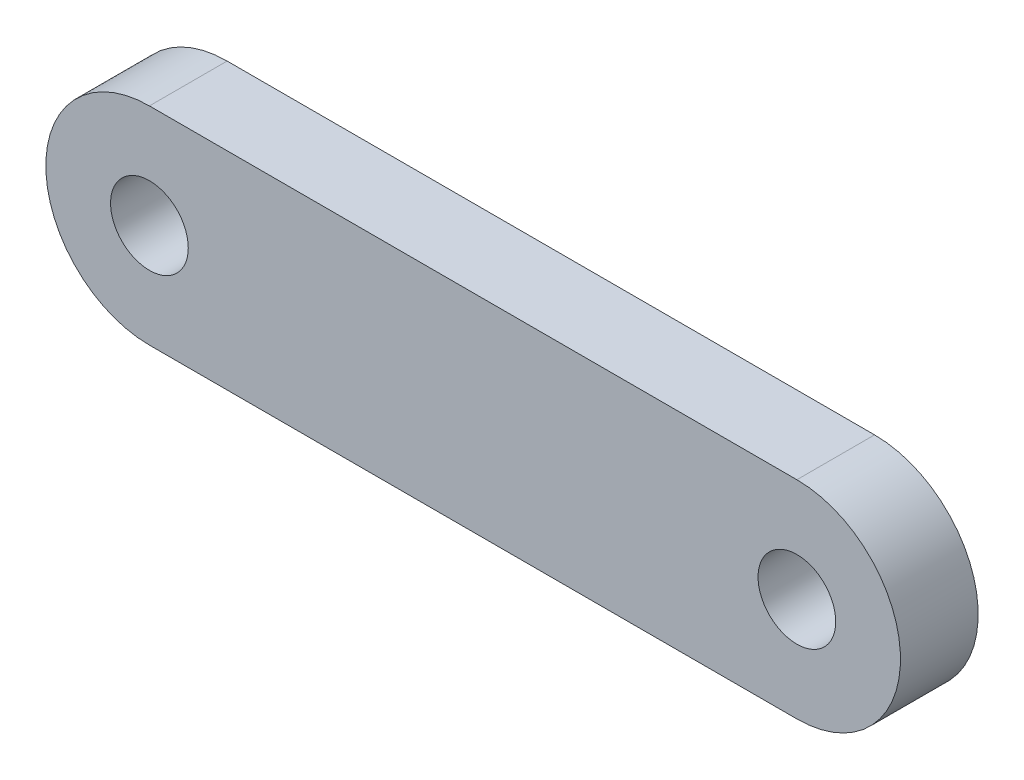
ISO-10303-21;
HEADER;
FILE_DESCRIPTION(('STEP AP214'),'2;1');
FILE_NAME('part.step','',(''),(''),'','','');
FILE_SCHEMA(('AUTOMOTIVE_DESIGN { 1 0 10303 214 1 1 1 1 }'));
ENDSEC;
DATA;
#1=APPLICATION_CONTEXT('core data for automotive mechanical design processes');
#2=APPLICATION_PROTOCOL_DEFINITION('international standard','automotive_design',2000,#1);
#3=PRODUCT_CONTEXT('',#1,'mechanical');
#4=PRODUCT('Part','Part','',(#3));
#5=PRODUCT_RELATED_PRODUCT_CATEGORY('part','',(#4));
#6=PRODUCT_DEFINITION_FORMATION('','',#4);
#7=PRODUCT_DEFINITION_CONTEXT('part definition',#1,'design');
#8=PRODUCT_DEFINITION('design','',#6,#7);
#9=PRODUCT_DEFINITION_SHAPE('','',#8);
#10=(LENGTH_UNIT() NAMED_UNIT(*) SI_UNIT(.MILLI.,.METRE.));
#11=(NAMED_UNIT(*) PLANE_ANGLE_UNIT() SI_UNIT($,.RADIAN.));
#12=(NAMED_UNIT(*) SI_UNIT($,.STERADIAN.) SOLID_ANGLE_UNIT());
#13=UNCERTAINTY_MEASURE_WITH_UNIT(LENGTH_MEASURE(1.E-05),#10,'distance_accuracy_value','');
#14=(GEOMETRIC_REPRESENTATION_CONTEXT(3) GLOBAL_UNCERTAINTY_ASSIGNED_CONTEXT((#13)) GLOBAL_UNIT_ASSIGNED_CONTEXT((#10,
#11,#12)) REPRESENTATION_CONTEXT('',''));
#15=CARTESIAN_POINT('',(0.,0.,0.));
#16=DIRECTION('',(0.,0.,1.));
#17=DIRECTION('',(1.,0.,0.));
#18=AXIS2_PLACEMENT_3D('',#15,#16,#17);
#19=CARTESIAN_POINT('',(-25.,0.,3.));
#20=DIRECTION('',(0.,0.,1.));
#21=DIRECTION('',(1.,0.,0.));
#22=AXIS2_PLACEMENT_3D('',#19,#20,#21);
#23=PLANE('',#22);
#24=CARTESIAN_POINT('',(0.,0.,3.));
#25=DIRECTION('',(0.,0.,1.));
#26=DIRECTION('',(1.,0.,0.));
#27=AXIS2_PLACEMENT_3D('',#24,#25,#26);
#28=CIRCLE('',#27,1.5);
#29=CARTESIAN_POINT('',(1.5,0.,3.));
#30=VERTEX_POINT('',#29);
#31=EDGE_CURVE('E116',#30,#30,#28,.T.);
#32=ORIENTED_EDGE('',*,*,#31,.F.);
#33=EDGE_LOOP('',(#32));
#34=FACE_BOUND('',#33,.T.);
#35=CARTESIAN_POINT('',(-25.,0.,3.));
#36=DIRECTION('',(0.,0.,1.));
#37=DIRECTION('',(1.,0.,0.));
#38=AXIS2_PLACEMENT_3D('',#35,#36,#37);
#39=CIRCLE('',#38,4.);
#40=CARTESIAN_POINT('',(-25.,4.,3.));
#41=VERTEX_POINT('',#40);
#42=CARTESIAN_POINT('',(-25.,-4.,3.));
#43=VERTEX_POINT('',#42);
#44=EDGE_CURVE('E96',#41,#43,#39,.T.);
#45=ORIENTED_EDGE('',*,*,#44,.T.);
#46=DIRECTION('',(1.,0.,0.));
#47=VECTOR('',#46,1.);
#48=CARTESIAN_POINT('',(-25.,-4.,3.));
#49=LINE('',#48,#47);
#50=CARTESIAN_POINT('',(0.,-4.,3.));
#51=VERTEX_POINT('',#50);
#52=EDGE_CURVE('E91',#43,#51,#49,.T.);
#53=ORIENTED_EDGE('',*,*,#52,.T.);
#54=CARTESIAN_POINT('',(0.,0.,3.));
#55=DIRECTION('',(0.,0.,1.));
#56=DIRECTION('',(1.,0.,0.));
#57=AXIS2_PLACEMENT_3D('',#54,#55,#56);
#58=CIRCLE('',#57,4.);
#59=CARTESIAN_POINT('',(0.,4.,3.));
#60=VERTEX_POINT('',#59);
#61=EDGE_CURVE('E94',#51,#60,#58,.T.);
#62=ORIENTED_EDGE('',*,*,#61,.T.);
#63=DIRECTION('',(-1.,0.,0.));
#64=VECTOR('',#63,1.);
#65=CARTESIAN_POINT('',(-25.,4.,3.));
#66=LINE('',#65,#64);
#67=EDGE_CURVE('E61',#60,#41,#66,.T.);
#68=ORIENTED_EDGE('',*,*,#67,.T.);
#69=EDGE_LOOP('',(#45,#53,#62,#68));
#70=FACE_BOUND('',#69,.T.);
#71=CARTESIAN_POINT('',(-25.,0.,3.));
#72=DIRECTION('',(0.,0.,1.));
#73=DIRECTION('',(1.,0.,0.));
#74=AXIS2_PLACEMENT_3D('',#71,#72,#73);
#75=CIRCLE('',#74,1.5);
#76=CARTESIAN_POINT('',(-23.5,0.,3.));
#77=VERTEX_POINT('',#76);
#78=EDGE_CURVE('E138',#77,#77,#75,.T.);
#79=ORIENTED_EDGE('',*,*,#78,.F.);
#80=EDGE_LOOP('',(#79));
#81=FACE_BOUND('',#80,.T.);
#82=ADVANCED_FACE('F43',(#34,#70,#81),#23,.T.);
#83=CARTESIAN_POINT('',(-25.,0.,0.));
#84=DIRECTION('',(0.,0.,1.));
#85=DIRECTION('',(1.,0.,0.));
#86=AXIS2_PLACEMENT_3D('',#83,#84,#85);
#87=PLANE('',#86);
#88=CARTESIAN_POINT('',(-25.,0.,0.));
#89=DIRECTION('',(0.,0.,1.));
#90=DIRECTION('',(1.,0.,0.));
#91=AXIS2_PLACEMENT_3D('',#88,#89,#90);
#92=CIRCLE('',#91,4.);
#93=CARTESIAN_POINT('',(-25.,4.,0.));
#94=VERTEX_POINT('',#93);
#95=CARTESIAN_POINT('',(-25.,-4.,0.));
#96=VERTEX_POINT('',#95);
#97=EDGE_CURVE('E112',#94,#96,#92,.T.);
#98=ORIENTED_EDGE('',*,*,#97,.F.);
#99=DIRECTION('',(-1.,0.,0.));
#100=VECTOR('',#99,1.);
#101=CARTESIAN_POINT('',(-25.,4.,0.));
#102=LINE('',#101,#100);
#103=CARTESIAN_POINT('',(0.,4.,0.));
#104=VERTEX_POINT('',#103);
#105=EDGE_CURVE('E84',#104,#94,#102,.T.);
#106=ORIENTED_EDGE('',*,*,#105,.F.);
#107=CARTESIAN_POINT('',(0.,0.,0.));
#108=DIRECTION('',(0.,0.,1.));
#109=DIRECTION('',(1.,0.,0.));
#110=AXIS2_PLACEMENT_3D('',#107,#108,#109);
#111=CIRCLE('',#110,4.);
#112=CARTESIAN_POINT('',(0.,-4.,0.));
#113=VERTEX_POINT('',#112);
#114=EDGE_CURVE('E78',#113,#104,#111,.T.);
#115=ORIENTED_EDGE('',*,*,#114,.F.);
#116=DIRECTION('',(1.,0.,0.));
#117=VECTOR('',#116,1.);
#118=CARTESIAN_POINT('',(-25.,-4.,0.));
#119=LINE('',#118,#117);
#120=EDGE_CURVE('E101',#96,#113,#119,.T.);
#121=ORIENTED_EDGE('',*,*,#120,.F.);
#122=EDGE_LOOP('',(#98,#106,#115,#121));
#123=FACE_BOUND('',#122,.T.);
#124=CARTESIAN_POINT('',(0.,0.,0.));
#125=DIRECTION('',(0.,0.,1.));
#126=DIRECTION('',(1.,0.,0.));
#127=AXIS2_PLACEMENT_3D('',#124,#125,#126);
#128=CIRCLE('',#127,1.5);
#129=CARTESIAN_POINT('',(1.5,0.,0.));
#130=VERTEX_POINT('',#129);
#131=EDGE_CURVE('E134',#130,#130,#128,.T.);
#132=ORIENTED_EDGE('',*,*,#131,.T.);
#133=EDGE_LOOP('',(#132));
#134=FACE_BOUND('',#133,.T.);
#135=CARTESIAN_POINT('',(-25.,0.,0.));
#136=DIRECTION('',(0.,0.,1.));
#137=DIRECTION('',(1.,0.,0.));
#138=AXIS2_PLACEMENT_3D('',#135,#136,#137);
#139=CIRCLE('',#138,1.5);
#140=CARTESIAN_POINT('',(-23.5,0.,0.));
#141=VERTEX_POINT('',#140);
#142=EDGE_CURVE('E142',#141,#141,#139,.T.);
#143=ORIENTED_EDGE('',*,*,#142,.T.);
#144=EDGE_LOOP('',(#143));
#145=FACE_BOUND('',#144,.T.);
#146=ADVANCED_FACE('F129',(#123,#134,#145),#87,.F.);
#147=CARTESIAN_POINT('',(-25.,0.,3.));
#148=DIRECTION('',(0.,0.,-1.));
#149=DIRECTION('',(-1.,0.,0.));
#150=AXIS2_PLACEMENT_3D('',#147,#148,#149);
#151=CYLINDRICAL_SURFACE('',#150,4.);
#152=ORIENTED_EDGE('',*,*,#97,.T.);
#153=DIRECTION('',(0.,0.,-1.));
#154=VECTOR('',#153,1.);
#155=CARTESIAN_POINT('',(-25.,-4.,3.));
#156=LINE('',#155,#154);
#157=EDGE_CURVE('E11',#43,#96,#156,.T.);
#158=ORIENTED_EDGE('',*,*,#157,.F.);
#159=ORIENTED_EDGE('',*,*,#44,.F.);
#160=DIRECTION('',(0.,0.,-1.));
#161=VECTOR('',#160,1.);
#162=CARTESIAN_POINT('',(-25.,4.,3.));
#163=LINE('',#162,#161);
#164=EDGE_CURVE('E108',#41,#94,#163,.T.);
#165=ORIENTED_EDGE('',*,*,#164,.T.);
#166=EDGE_LOOP('',(#152,#158,#159,#165));
#167=FACE_BOUND('',#166,.T.);
#168=ADVANCED_FACE('F45',(#167),#151,.T.);
#169=CARTESIAN_POINT('',(-25.,-4.,3.));
#170=DIRECTION('',(0.,1.,0.));
#171=DIRECTION('',(0.,0.,1.));
#172=AXIS2_PLACEMENT_3D('',#169,#170,#171);
#173=PLANE('',#172);
#174=ORIENTED_EDGE('',*,*,#120,.T.);
#175=DIRECTION('',(0.,0.,-1.));
#176=VECTOR('',#175,1.);
#177=CARTESIAN_POINT('',(0.,-4.,3.));
#178=LINE('',#177,#176);
#179=EDGE_CURVE('E53',#51,#113,#178,.T.);
#180=ORIENTED_EDGE('',*,*,#179,.F.);
#181=ORIENTED_EDGE('',*,*,#52,.F.);
#182=ORIENTED_EDGE('',*,*,#157,.T.);
#183=EDGE_LOOP('',(#174,#180,#181,#182));
#184=FACE_BOUND('',#183,.T.);
#185=ADVANCED_FACE('F100',(#184),#173,.F.);
#186=CARTESIAN_POINT('',(0.,0.,3.));
#187=DIRECTION('',(0.,0.,-1.));
#188=DIRECTION('',(-1.,0.,0.));
#189=AXIS2_PLACEMENT_3D('',#186,#187,#188);
#190=CYLINDRICAL_SURFACE('',#189,4.);
#191=ORIENTED_EDGE('',*,*,#114,.T.);
#192=DIRECTION('',(0.,0.,-1.));
#193=VECTOR('',#192,1.);
#194=CARTESIAN_POINT('',(0.,4.,3.));
#195=LINE('',#194,#193);
#196=EDGE_CURVE('E103',#60,#104,#195,.T.);
#197=ORIENTED_EDGE('',*,*,#196,.F.);
#198=ORIENTED_EDGE('',*,*,#61,.F.);
#199=ORIENTED_EDGE('',*,*,#179,.T.);
#200=EDGE_LOOP('',(#191,#197,#198,#199));
#201=FACE_BOUND('',#200,.T.);
#202=ADVANCED_FACE('F104',(#201),#190,.T.);
#203=CARTESIAN_POINT('',(-25.,4.,3.));
#204=DIRECTION('',(0.,-1.,0.));
#205=DIRECTION('',(1.,0.,0.));
#206=AXIS2_PLACEMENT_3D('',#203,#204,#205);
#207=PLANE('',#206);
#208=ORIENTED_EDGE('',*,*,#105,.T.);
#209=ORIENTED_EDGE('',*,*,#164,.F.);
#210=ORIENTED_EDGE('',*,*,#67,.F.);
#211=ORIENTED_EDGE('',*,*,#196,.T.);
#212=EDGE_LOOP('',(#208,#209,#210,#211));
#213=FACE_BOUND('',#212,.T.);
#214=ADVANCED_FACE('F126',(#213),#207,.F.);
#215=CARTESIAN_POINT('',(0.,0.,3.));
#216=DIRECTION('',(0.,0.,-1.));
#217=DIRECTION('',(-1.,0.,0.));
#218=AXIS2_PLACEMENT_3D('',#215,#216,#217);
#219=CYLINDRICAL_SURFACE('',#218,1.5);
#220=ORIENTED_EDGE('',*,*,#31,.T.);
#221=EDGE_LOOP('',(#220));
#222=FACE_BOUND('',#221,.T.);
#223=ORIENTED_EDGE('',*,*,#131,.F.);
#224=EDGE_LOOP('',(#223));
#225=FACE_BOUND('',#224,.T.);
#226=ADVANCED_FACE('F161',(#222,#225),#219,.F.);
#227=CARTESIAN_POINT('',(-25.,0.,3.));
#228=DIRECTION('',(0.,0.,-1.));
#229=DIRECTION('',(-1.,0.,0.));
#230=AXIS2_PLACEMENT_3D('',#227,#228,#229);
#231=CYLINDRICAL_SURFACE('',#230,1.5);
#232=ORIENTED_EDGE('',*,*,#78,.T.);
#233=EDGE_LOOP('',(#232));
#234=FACE_BOUND('',#233,.T.);
#235=ORIENTED_EDGE('',*,*,#142,.F.);
#236=EDGE_LOOP('',(#235));
#237=FACE_BOUND('',#236,.T.);
#238=ADVANCED_FACE('F150',(#234,#237),#231,.F.);
#239=CLOSED_SHELL('',(#82,#146,#168,#185,#202,#214,#226,#238));
#240=MANIFOLD_SOLID_BREP('B2',#239);
#241=ADVANCED_BREP_SHAPE_REPRESENTATION('',(#18,#240),#14);
#242=SHAPE_DEFINITION_REPRESENTATION(#9,#241);
ENDSEC;
END-ISO-10303-21;
